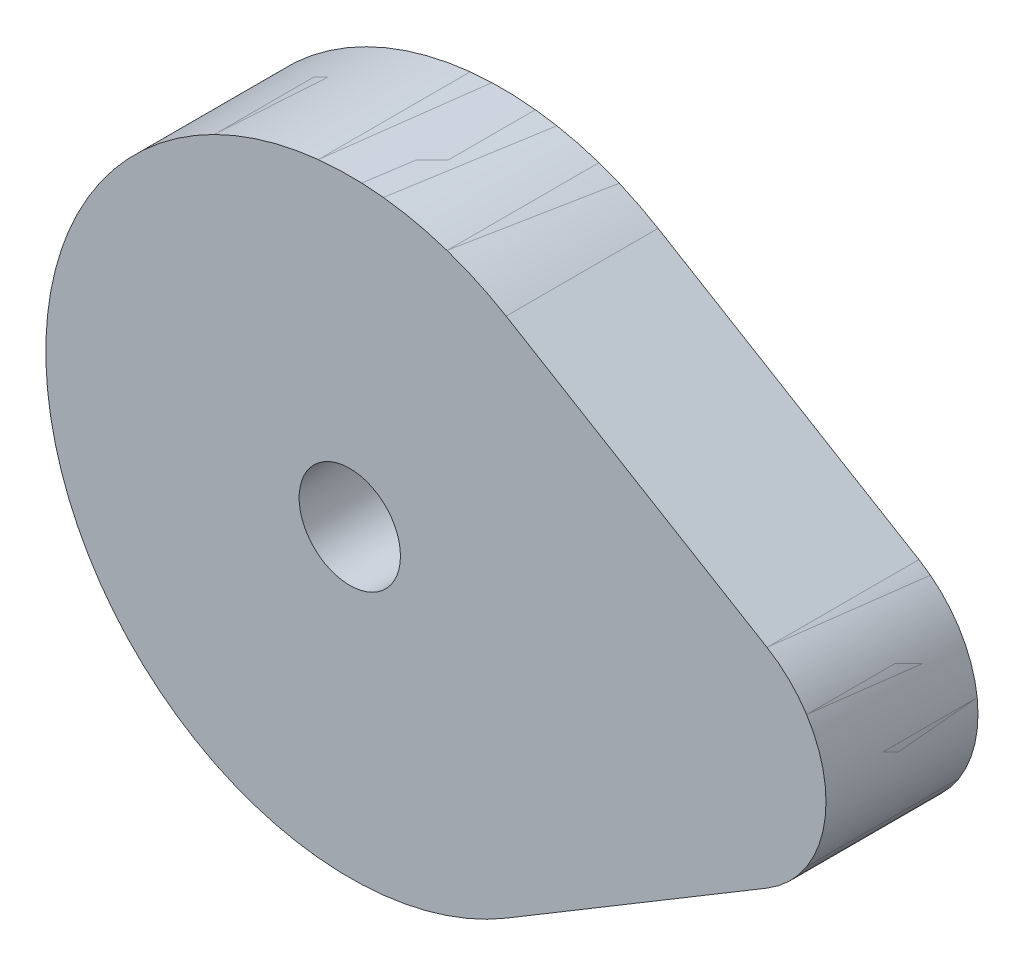
ISO-10303-21;
HEADER;
FILE_DESCRIPTION(('STEP AP214'),'2;1');
FILE_NAME('part.step','',(''),(''),'','','');
FILE_SCHEMA(('AUTOMOTIVE_DESIGN { 1 0 10303 214 1 1 1 1 }'));
ENDSEC;
DATA;
#1=APPLICATION_CONTEXT('core data for automotive mechanical design processes');
#2=APPLICATION_PROTOCOL_DEFINITION('international standard','automotive_design',2000,#1);
#3=PRODUCT_CONTEXT('',#1,'mechanical');
#4=PRODUCT('Part','Part','',(#3));
#5=PRODUCT_RELATED_PRODUCT_CATEGORY('part','',(#4));
#6=PRODUCT_DEFINITION_FORMATION('','',#4);
#7=PRODUCT_DEFINITION_CONTEXT('part definition',#1,'design');
#8=PRODUCT_DEFINITION('design','',#6,#7);
#9=PRODUCT_DEFINITION_SHAPE('','',#8);
#10=(LENGTH_UNIT() NAMED_UNIT(*) SI_UNIT(.MILLI.,.METRE.));
#11=(NAMED_UNIT(*) PLANE_ANGLE_UNIT() SI_UNIT($,.RADIAN.));
#12=(NAMED_UNIT(*) SI_UNIT($,.STERADIAN.) SOLID_ANGLE_UNIT());
#13=UNCERTAINTY_MEASURE_WITH_UNIT(LENGTH_MEASURE(1.E-05),#10,'distance_accuracy_value','');
#14=(GEOMETRIC_REPRESENTATION_CONTEXT(3) GLOBAL_UNCERTAINTY_ASSIGNED_CONTEXT((#13)) GLOBAL_UNIT_ASSIGNED_CONTEXT((#10,
#11,#12)) REPRESENTATION_CONTEXT('',''));
#15=CARTESIAN_POINT('',(0.,0.,0.));
#16=DIRECTION('',(0.,0.,1.));
#17=DIRECTION('',(1.,0.,0.));
#18=AXIS2_PLACEMENT_3D('',#15,#16,#17);
#19=CARTESIAN_POINT('',(35.,0.,15.));
#20=DIRECTION('',(0.,0.,-1.));
#21=DIRECTION('',(-1.,0.,0.));
#22=AXIS2_PLACEMENT_3D('',#19,#20,#21);
#23=CYLINDRICAL_SURFACE('',#22,12.);
#24=CARTESIAN_POINT('',(35.,0.,0.));
#25=DIRECTION('',(0.,0.,1.));
#26=DIRECTION('',(1.,0.,0.));
#27=AXIS2_PLACEMENT_3D('',#24,#25,#26);
#28=CIRCLE('',#27,12.);
#29=CARTESIAN_POINT('',(41.1714285714286,-10.2914269850082,0.));
#30=VERTEX_POINT('',#29);
#31=CARTESIAN_POINT('',(41.1714285714286,10.2914269850082,0.));
#32=VERTEX_POINT('',#31);
#33=EDGE_CURVE('E53',#30,#32,#28,.T.);
#34=ORIENTED_EDGE('',*,*,#33,.F.);
#35=DIRECTION('',(0.,0.,-1.));
#36=VECTOR('',#35,1.);
#37=CARTESIAN_POINT('',(41.1714285714286,-10.2914269850082,15.));
#38=LINE('',#37,#36);
#39=CARTESIAN_POINT('',(41.1714285714286,-10.2914269850082,15.));
#40=VERTEX_POINT('',#39);
#41=EDGE_CURVE('E88',#40,#30,#38,.T.);
#42=ORIENTED_EDGE('',*,*,#41,.F.);
#43=CARTESIAN_POINT('',(35.,0.,15.));
#44=DIRECTION('',(0.,0.,1.));
#45=DIRECTION('',(1.,0.,0.));
#46=AXIS2_PLACEMENT_3D('',#43,#44,#45);
#47=CIRCLE('',#46,12.);
#48=CARTESIAN_POINT('',(41.1714285714286,10.2914269850082,15.));
#49=VERTEX_POINT('',#48);
#50=EDGE_CURVE('E12',#40,#49,#47,.T.);
#51=ORIENTED_EDGE('',*,*,#50,.T.);
#52=DIRECTION('',(0.,0.,-1.));
#53=VECTOR('',#52,1.);
#54=CARTESIAN_POINT('',(41.1714285714286,10.2914269850082,15.));
#55=LINE('',#54,#53);
#56=EDGE_CURVE('E62',#49,#32,#55,.T.);
#57=ORIENTED_EDGE('',*,*,#56,.T.);
#58=EDGE_LOOP('',(#34,#42,#51,#57));
#59=FACE_BOUND('',#58,.T.);
#60=ADVANCED_FACE('F45',(#59),#23,.F.);
#61=CARTESIAN_POINT('',(41.1714285714286,10.2914269850082,15.));
#62=DIRECTION('',(-0.514285714285714,-0.857618915417351,0.));
#63=DIRECTION('',(0.857618915417351,-0.514285714285714,0.));
#64=AXIS2_PLACEMENT_3D('',#61,#62,#63);
#65=PLANE('',#64);
#66=DIRECTION('',(-0.857618915417351,0.514285714285714,0.));
#67=VECTOR('',#66,1.);
#68=CARTESIAN_POINT('',(41.1714285714286,10.2914269850082,0.));
#69=LINE('',#68,#67);
#70=CARTESIAN_POINT('',(15.4285714285714,25.7285674625205,0.));
#71=VERTEX_POINT('',#70);
#72=EDGE_CURVE('E107',#32,#71,#69,.T.);
#73=ORIENTED_EDGE('',*,*,#72,.F.);
#74=ORIENTED_EDGE('',*,*,#56,.F.);
#75=DIRECTION('',(-0.857618915417351,0.514285714285714,0.));
#76=VECTOR('',#75,1.);
#77=CARTESIAN_POINT('',(41.1714285714286,10.2914269850082,15.));
#78=LINE('',#77,#76);
#79=CARTESIAN_POINT('',(15.4285714285714,25.7285674625205,15.));
#80=VERTEX_POINT('',#79);
#81=EDGE_CURVE('E108',#49,#80,#78,.T.);
#82=ORIENTED_EDGE('',*,*,#81,.T.);
#83=DIRECTION('',(0.,0.,-1.));
#84=VECTOR('',#83,1.);
#85=CARTESIAN_POINT('',(15.4285714285714,25.7285674625205,15.));
#86=LINE('',#85,#84);
#87=EDGE_CURVE('E76',#80,#71,#86,.T.);
#88=ORIENTED_EDGE('',*,*,#87,.T.);
#89=EDGE_LOOP('',(#73,#74,#82,#88));
#90=FACE_BOUND('',#89,.T.);
#91=ADVANCED_FACE('F132',(#90),#65,.T.);
#92=CARTESIAN_POINT('',(0.,0.,15.));
#93=DIRECTION('',(0.,0.,-1.));
#94=DIRECTION('',(-1.,0.,0.));
#95=AXIS2_PLACEMENT_3D('',#92,#93,#94);
#96=CYLINDRICAL_SURFACE('',#95,30.);
#97=CARTESIAN_POINT('',(0.,0.,0.));
#98=DIRECTION('',(0.,0.,1.));
#99=DIRECTION('',(1.,0.,0.));
#100=AXIS2_PLACEMENT_3D('',#97,#98,#99);
#101=CIRCLE('',#100,30.);
#102=CARTESIAN_POINT('',(15.4285714285714,-25.7285674625205,0.));
#103=VERTEX_POINT('',#102);
#104=EDGE_CURVE('E92',#71,#103,#101,.T.);
#105=ORIENTED_EDGE('',*,*,#104,.F.);
#106=ORIENTED_EDGE('',*,*,#87,.F.);
#107=CARTESIAN_POINT('',(0.,0.,15.));
#108=DIRECTION('',(0.,0.,1.));
#109=DIRECTION('',(1.,0.,0.));
#110=AXIS2_PLACEMENT_3D('',#107,#108,#109);
#111=CIRCLE('',#110,30.);
#112=CARTESIAN_POINT('',(15.4285714285714,-25.7285674625205,15.));
#113=VERTEX_POINT('',#112);
#114=EDGE_CURVE('E104',#80,#113,#111,.T.);
#115=ORIENTED_EDGE('',*,*,#114,.T.);
#116=DIRECTION('',(0.,0.,-1.));
#117=VECTOR('',#116,1.);
#118=CARTESIAN_POINT('',(15.4285714285714,-25.7285674625205,15.));
#119=LINE('',#118,#117);
#120=EDGE_CURVE('E47',#113,#103,#119,.T.);
#121=ORIENTED_EDGE('',*,*,#120,.T.);
#122=EDGE_LOOP('',(#105,#106,#115,#121));
#123=FACE_BOUND('',#122,.T.);
#124=ADVANCED_FACE('F134',(#123),#96,.F.);
#125=CARTESIAN_POINT('',(15.4285714285714,-25.7285674625205,15.));
#126=DIRECTION('',(-0.514285714285714,0.85761891541735,0.));
#127=DIRECTION('',(-0.857618915417351,-0.514285714285714,0.));
#128=AXIS2_PLACEMENT_3D('',#125,#126,#127);
#129=PLANE('',#128);
#130=DIRECTION('',(0.857618915417351,0.514285714285714,0.));
#131=VECTOR('',#130,1.);
#132=CARTESIAN_POINT('',(15.4285714285714,-25.7285674625205,0.));
#133=LINE('',#132,#131);
#134=EDGE_CURVE('E102',#103,#30,#133,.T.);
#135=ORIENTED_EDGE('',*,*,#134,.F.);
#136=ORIENTED_EDGE('',*,*,#120,.F.);
#137=DIRECTION('',(0.857618915417351,0.514285714285714,0.));
#138=VECTOR('',#137,1.);
#139=CARTESIAN_POINT('',(15.4285714285714,-25.7285674625205,15.));
#140=LINE('',#139,#138);
#141=EDGE_CURVE('E93',#113,#40,#140,.T.);
#142=ORIENTED_EDGE('',*,*,#141,.T.);
#143=ORIENTED_EDGE('',*,*,#41,.T.);
#144=EDGE_LOOP('',(#135,#136,#142,#143));
#145=FACE_BOUND('',#144,.T.);
#146=ADVANCED_FACE('F94',(#145),#129,.T.);
#147=OPEN_SHELL('',(#60,#91,#124,#146));
#148=SHELL_BASED_SURFACE_MODEL('B2',(#147));
#149=CARTESIAN_POINT('',(0.,0.,15.));
#150=DIRECTION('',(0.,0.,1.));
#151=DIRECTION('',(1.,0.,0.));
#152=AXIS2_PLACEMENT_3D('',#149,#150,#151);
#153=PLANE('',#152);
#154=CARTESIAN_POINT('',(0.,0.,15.));
#155=DIRECTION('',(0.,0.,1.));
#156=DIRECTION('',(1.,0.,0.));
#157=AXIS2_PLACEMENT_3D('',#154,#155,#156);
#158=CIRCLE('',#157,30.);
#159=CARTESIAN_POINT('',(15.4285714285714,25.7285674625205,15.));
#160=VERTEX_POINT('',#159);
#161=CARTESIAN_POINT('',(15.4285714285714,-25.7285674625205,15.));
#162=VERTEX_POINT('',#161);
#163=EDGE_CURVE('E223',#160,#162,#158,.T.);
#164=ORIENTED_EDGE('',*,*,#163,.T.);
#165=DIRECTION('',(0.857618915417351,0.514285714285714,0.));
#166=VECTOR('',#165,1.);
#167=CARTESIAN_POINT('',(41.1714285714286,-10.2914269850082,15.));
#168=LINE('',#167,#166);
#169=CARTESIAN_POINT('',(41.1714285714286,-10.2914269850082,15.));
#170=VERTEX_POINT('',#169);
#171=EDGE_CURVE('E218',#162,#170,#168,.T.);
#172=ORIENTED_EDGE('',*,*,#171,.T.);
#173=CARTESIAN_POINT('',(35.,0.,15.));
#174=DIRECTION('',(0.,0.,1.));
#175=DIRECTION('',(1.,0.,0.));
#176=AXIS2_PLACEMENT_3D('',#173,#174,#175);
#177=CIRCLE('',#176,12.);
#178=CARTESIAN_POINT('',(41.1714285714286,10.2914269850082,15.));
#179=VERTEX_POINT('',#178);
#180=EDGE_CURVE('E221',#170,#179,#177,.T.);
#181=ORIENTED_EDGE('',*,*,#180,.T.);
#182=DIRECTION('',(-0.857618915417351,0.514285714285714,0.));
#183=VECTOR('',#182,1.);
#184=CARTESIAN_POINT('',(41.1714285714286,10.2914269850082,15.));
#185=LINE('',#184,#183);
#186=EDGE_CURVE('E188',#179,#160,#185,.T.);
#187=ORIENTED_EDGE('',*,*,#186,.T.);
#188=EDGE_LOOP('',(#164,#172,#181,#187));
#189=FACE_BOUND('',#188,.T.);
#190=CARTESIAN_POINT('',(0.,0.,15.));
#191=DIRECTION('',(0.,0.,1.));
#192=DIRECTION('',(1.,0.,0.));
#193=AXIS2_PLACEMENT_3D('',#190,#191,#192);
#194=CIRCLE('',#193,5.);
#195=CARTESIAN_POINT('',(5.,0.,15.));
#196=VERTEX_POINT('',#195);
#197=EDGE_CURVE('E238',#196,#196,#194,.T.);
#198=ORIENTED_EDGE('',*,*,#197,.F.);
#199=EDGE_LOOP('',(#198));
#200=FACE_BOUND('',#199,.T.);
#201=ADVANCED_FACE('F171',(#189,#200),#153,.T.);
#202=CARTESIAN_POINT('',(0.,0.,0.));
#203=DIRECTION('',(0.,0.,1.));
#204=DIRECTION('',(1.,0.,0.));
#205=AXIS2_PLACEMENT_3D('',#202,#203,#204);
#206=PLANE('',#205);
#207=CARTESIAN_POINT('',(0.,0.,0.));
#208=DIRECTION('',(0.,0.,1.));
#209=DIRECTION('',(1.,0.,0.));
#210=AXIS2_PLACEMENT_3D('',#207,#208,#209);
#211=CIRCLE('',#210,30.);
#212=CARTESIAN_POINT('',(15.4285714285714,25.7285674625205,0.));
#213=VERTEX_POINT('',#212);
#214=CARTESIAN_POINT('',(15.4285714285714,-25.7285674625205,0.));
#215=VERTEX_POINT('',#214);
#216=EDGE_CURVE('E235',#213,#215,#211,.T.);
#217=ORIENTED_EDGE('',*,*,#216,.F.);
#218=DIRECTION('',(-0.857618915417351,0.514285714285714,0.));
#219=VECTOR('',#218,1.);
#220=CARTESIAN_POINT('',(41.1714285714286,10.2914269850082,0.));
#221=LINE('',#220,#219);
#222=CARTESIAN_POINT('',(41.1714285714286,10.2914269850082,0.));
#223=VERTEX_POINT('',#222);
#224=EDGE_CURVE('E211',#223,#213,#221,.T.);
#225=ORIENTED_EDGE('',*,*,#224,.F.);
#226=CARTESIAN_POINT('',(35.,0.,0.));
#227=DIRECTION('',(0.,0.,1.));
#228=DIRECTION('',(1.,0.,0.));
#229=AXIS2_PLACEMENT_3D('',#226,#227,#228);
#230=CIRCLE('',#229,12.);
#231=CARTESIAN_POINT('',(41.1714285714286,-10.2914269850082,0.));
#232=VERTEX_POINT('',#231);
#233=EDGE_CURVE('E205',#232,#223,#230,.T.);
#234=ORIENTED_EDGE('',*,*,#233,.F.);
#235=DIRECTION('',(0.857618915417351,0.514285714285714,0.));
#236=VECTOR('',#235,1.);
#237=CARTESIAN_POINT('',(41.1714285714286,-10.2914269850082,0.));
#238=LINE('',#237,#236);
#239=EDGE_CURVE('E227',#215,#232,#238,.T.);
#240=ORIENTED_EDGE('',*,*,#239,.F.);
#241=EDGE_LOOP('',(#217,#225,#234,#240));
#242=FACE_BOUND('',#241,.T.);
#243=CARTESIAN_POINT('',(0.,0.,0.));
#244=DIRECTION('',(0.,0.,1.));
#245=DIRECTION('',(1.,0.,0.));
#246=AXIS2_PLACEMENT_3D('',#243,#244,#245);
#247=CIRCLE('',#246,5.);
#248=CARTESIAN_POINT('',(5.,0.,0.));
#249=VERTEX_POINT('',#248);
#250=EDGE_CURVE('E250',#249,#249,#247,.T.);
#251=ORIENTED_EDGE('',*,*,#250,.T.);
#252=EDGE_LOOP('',(#251));
#253=FACE_BOUND('',#252,.T.);
#254=ADVANCED_FACE('F246',(#242,#253),#206,.F.);
#255=CARTESIAN_POINT('',(0.,0.,15.));
#256=DIRECTION('',(0.,0.,-1.));
#257=DIRECTION('',(-1.,0.,0.));
#258=AXIS2_PLACEMENT_3D('',#255,#256,#257);
#259=CYLINDRICAL_SURFACE('',#258,30.);
#260=ORIENTED_EDGE('',*,*,#216,.T.);
#261=DIRECTION('',(0.,0.,-1.));
#262=VECTOR('',#261,1.);
#263=CARTESIAN_POINT('',(15.4285714285714,-25.7285674625205,15.));
#264=LINE('',#263,#262);
#265=EDGE_CURVE('E43',#162,#215,#264,.T.);
#266=ORIENTED_EDGE('',*,*,#265,.F.);
#267=ORIENTED_EDGE('',*,*,#163,.F.);
#268=DIRECTION('',(0.,0.,-1.));
#269=VECTOR('',#268,1.);
#270=CARTESIAN_POINT('',(15.4285714285714,25.7285674625205,15.));
#271=LINE('',#270,#269);
#272=EDGE_CURVE('E231',#160,#213,#271,.T.);
#273=ORIENTED_EDGE('',*,*,#272,.T.);
#274=EDGE_LOOP('',(#260,#266,#267,#273));
#275=FACE_BOUND('',#274,.T.);
#276=ADVANCED_FACE('F173',(#275),#259,.T.);
#277=CARTESIAN_POINT('',(41.1714285714286,-10.2914269850082,15.));
#278=DIRECTION('',(-0.514285714285714,0.85761891541735,0.));
#279=DIRECTION('',(-0.857618915417351,-0.514285714285714,0.));
#280=AXIS2_PLACEMENT_3D('',#277,#278,#279);
#281=PLANE('',#280);
#282=ORIENTED_EDGE('',*,*,#239,.T.);
#283=DIRECTION('',(0.,0.,-1.));
#284=VECTOR('',#283,1.);
#285=CARTESIAN_POINT('',(41.1714285714286,-10.2914269850082,15.));
#286=LINE('',#285,#284);
#287=EDGE_CURVE('E180',#170,#232,#286,.T.);
#288=ORIENTED_EDGE('',*,*,#287,.F.);
#289=ORIENTED_EDGE('',*,*,#171,.F.);
#290=ORIENTED_EDGE('',*,*,#265,.T.);
#291=EDGE_LOOP('',(#282,#288,#289,#290));
#292=FACE_BOUND('',#291,.T.);
#293=ADVANCED_FACE('F226',(#292),#281,.F.);
#294=CARTESIAN_POINT('',(35.,0.,15.));
#295=DIRECTION('',(0.,0.,-1.));
#296=DIRECTION('',(-1.,0.,0.));
#297=AXIS2_PLACEMENT_3D('',#294,#295,#296);
#298=CYLINDRICAL_SURFACE('',#297,12.);
#299=ORIENTED_EDGE('',*,*,#233,.T.);
#300=DIRECTION('',(0.,0.,-1.));
#301=VECTOR('',#300,1.);
#302=CARTESIAN_POINT('',(41.1714285714286,10.2914269850082,15.));
#303=LINE('',#302,#301);
#304=EDGE_CURVE('E228',#179,#223,#303,.T.);
#305=ORIENTED_EDGE('',*,*,#304,.F.);
#306=ORIENTED_EDGE('',*,*,#180,.F.);
#307=ORIENTED_EDGE('',*,*,#287,.T.);
#308=EDGE_LOOP('',(#299,#305,#306,#307));
#309=FACE_BOUND('',#308,.T.);
#310=ADVANCED_FACE('F229',(#309),#298,.T.);
#311=CARTESIAN_POINT('',(41.1714285714286,10.2914269850082,15.));
#312=DIRECTION('',(-0.514285714285714,-0.85761891541735,0.));
#313=DIRECTION('',(0.857618915417351,-0.514285714285714,0.));
#314=AXIS2_PLACEMENT_3D('',#311,#312,#313);
#315=PLANE('',#314);
#316=ORIENTED_EDGE('',*,*,#224,.T.);
#317=ORIENTED_EDGE('',*,*,#272,.F.);
#318=ORIENTED_EDGE('',*,*,#186,.F.);
#319=ORIENTED_EDGE('',*,*,#304,.T.);
#320=EDGE_LOOP('',(#316,#317,#318,#319));
#321=FACE_BOUND('',#320,.T.);
#322=ADVANCED_FACE('F243',(#321),#315,.F.);
#323=CARTESIAN_POINT('',(0.,0.,15.));
#324=DIRECTION('',(0.,0.,-1.));
#325=DIRECTION('',(-1.,0.,0.));
#326=AXIS2_PLACEMENT_3D('',#323,#324,#325);
#327=CYLINDRICAL_SURFACE('',#326,5.);
#328=ORIENTED_EDGE('',*,*,#197,.T.);
#329=EDGE_LOOP('',(#328));
#330=FACE_BOUND('',#329,.T.);
#331=ORIENTED_EDGE('',*,*,#250,.F.);
#332=EDGE_LOOP('',(#331));
#333=FACE_BOUND('',#332,.T.);
#334=ADVANCED_FACE('F256',(#330,#333),#327,.F.);
#335=CLOSED_SHELL('',(#201,#254,#276,#293,#310,#322,#334));
#336=MANIFOLD_SOLID_BREP('B6',#335);
#337=ADVANCED_BREP_SHAPE_REPRESENTATION('',(#18,#336),#14);
#338=MANIFOLD_SURFACE_SHAPE_REPRESENTATION('',(#18,#148),#14);
#339=SHAPE_REPRESENTATION('',(#18),#14);
#340=SHAPE_DEFINITION_REPRESENTATION(#9,#339);
#341=SHAPE_REPRESENTATION_RELATIONSHIP('','',#339,#337);
#342=SHAPE_REPRESENTATION_RELATIONSHIP('','',#339,#338);
ENDSEC;
END-ISO-10303-21;
